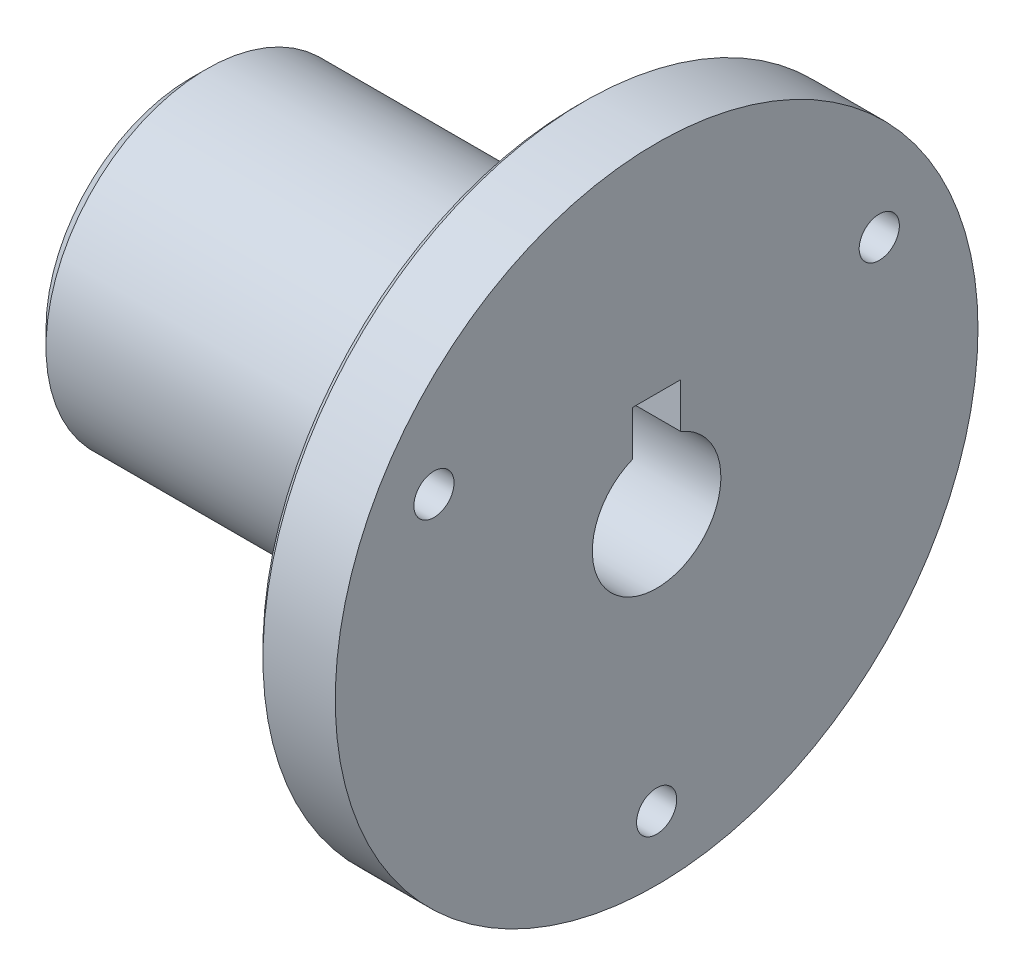
ISO-10303-21;
HEADER;
FILE_DESCRIPTION(('STEP AP214'),'2;1');
FILE_NAME('part.step','',(''),(''),'','','');
FILE_SCHEMA(('AUTOMOTIVE_DESIGN { 1 0 10303 214 1 1 1 1 }'));
ENDSEC;
DATA;
#1=APPLICATION_CONTEXT('core data for automotive mechanical design processes');
#2=APPLICATION_PROTOCOL_DEFINITION('international standard','automotive_design',2000,#1);
#3=PRODUCT_CONTEXT('',#1,'mechanical');
#4=PRODUCT('Part','Part','',(#3));
#5=PRODUCT_RELATED_PRODUCT_CATEGORY('part','',(#4));
#6=PRODUCT_DEFINITION_FORMATION('','',#4);
#7=PRODUCT_DEFINITION_CONTEXT('part definition',#1,'design');
#8=PRODUCT_DEFINITION('design','',#6,#7);
#9=PRODUCT_DEFINITION_SHAPE('','',#8);
#10=(LENGTH_UNIT() NAMED_UNIT(*) SI_UNIT(.MILLI.,.METRE.));
#11=(NAMED_UNIT(*) PLANE_ANGLE_UNIT() SI_UNIT($,.RADIAN.));
#12=(NAMED_UNIT(*) SI_UNIT($,.STERADIAN.) SOLID_ANGLE_UNIT());
#13=UNCERTAINTY_MEASURE_WITH_UNIT(LENGTH_MEASURE(1.E-05),#10,'distance_accuracy_value','');
#14=(GEOMETRIC_REPRESENTATION_CONTEXT(3) GLOBAL_UNCERTAINTY_ASSIGNED_CONTEXT((#13)) GLOBAL_UNIT_ASSIGNED_CONTEXT((#10,
#11,#12)) REPRESENTATION_CONTEXT('',''));
#15=CARTESIAN_POINT('',(0.,0.,0.));
#16=DIRECTION('',(0.,0.,1.));
#17=DIRECTION('',(1.,0.,0.));
#18=AXIS2_PLACEMENT_3D('',#15,#16,#17);
#19=CARTESIAN_POINT('',(0.,0.,0.));
#20=DIRECTION('',(1.,0.,0.));
#21=DIRECTION('',(0.,0.,-1.));
#22=AXIS2_PLACEMENT_3D('',#19,#20,#21);
#23=PLANE('',#22);
#24=CARTESIAN_POINT('',(0.,0.,0.));
#25=DIRECTION('',(1.,0.,0.));
#26=DIRECTION('',(0.,0.,-1.));
#27=AXIS2_PLACEMENT_3D('',#24,#25,#26);
#28=CIRCLE('',#27,9.);
#29=CARTESIAN_POINT('',(0.,0.,-9.));
#30=VERTEX_POINT('',#29);
#31=EDGE_CURVE('E304',#30,#30,#28,.F.);
#32=ORIENTED_EDGE('',*,*,#31,.T.);
#33=EDGE_LOOP('',(#32));
#34=FACE_BOUND('',#33,.T.);
#35=DIRECTION('',(0.,-1.,0.));
#36=VECTOR('',#35,1.);
#37=CARTESIAN_POINT('',(0.,6.,1.5));
#38=LINE('',#37,#36);
#39=CARTESIAN_POINT('',(0.,6.5,1.5));
#40=VERTEX_POINT('',#39);
#41=CARTESIAN_POINT('',(0.,4.24264068711928,1.5));
#42=VERTEX_POINT('',#41);
#43=EDGE_CURVE('E145',#40,#42,#38,.T.);
#44=ORIENTED_EDGE('',*,*,#43,.T.);
#45=CARTESIAN_POINT('',(0.,0.,0.));
#46=DIRECTION('',(1.,0.,0.));
#47=DIRECTION('',(0.,0.,-1.));
#48=AXIS2_PLACEMENT_3D('',#45,#46,#47);
#49=CIRCLE('',#48,4.5);
#50=CARTESIAN_POINT('',(0.,4.24264068711928,-1.5));
#51=VERTEX_POINT('',#50);
#52=EDGE_CURVE('E98',#42,#51,#49,.T.);
#53=ORIENTED_EDGE('',*,*,#52,.T.);
#54=DIRECTION('',(0.,1.,0.));
#55=VECTOR('',#54,1.);
#56=CARTESIAN_POINT('',(0.,6.5,-1.5));
#57=LINE('',#56,#55);
#58=CARTESIAN_POINT('',(0.,6.5,-1.5));
#59=VERTEX_POINT('',#58);
#60=EDGE_CURVE('E140',#51,#59,#57,.T.);
#61=ORIENTED_EDGE('',*,*,#60,.T.);
#62=DIRECTION('',(0.,0.,1.));
#63=VECTOR('',#62,1.);
#64=CARTESIAN_POINT('',(0.,6.5,1.5));
#65=LINE('',#64,#63);
#66=EDGE_CURVE('E142',#59,#40,#65,.T.);
#67=ORIENTED_EDGE('',*,*,#66,.T.);
#68=EDGE_LOOP('',(#44,#53,#61,#67));
#69=FACE_BOUND('',#68,.T.);
#70=ADVANCED_FACE('F44',(#34,#69),#23,.F.);
#71=CARTESIAN_POINT('',(24.,0.,0.));
#72=DIRECTION('',(-1.,0.,0.));
#73=DIRECTION('',(0.,0.,1.));
#74=AXIS2_PLACEMENT_3D('',#71,#72,#73);
#75=CYLINDRICAL_SURFACE('',#74,10.);
#76=CARTESIAN_POINT('',(22.,0.,0.));
#77=DIRECTION('',(1.,0.,0.));
#78=DIRECTION('',(0.,0.,-1.));
#79=AXIS2_PLACEMENT_3D('',#76,#77,#78);
#80=CIRCLE('',#79,10.);
#81=CARTESIAN_POINT('',(22.,0.,-10.));
#82=VERTEX_POINT('',#81);
#83=EDGE_CURVE('E11',#82,#82,#80,.F.);
#84=ORIENTED_EDGE('',*,*,#83,.T.);
#85=EDGE_LOOP('',(#84));
#86=FACE_BOUND('',#85,.T.);
#87=CARTESIAN_POINT('',(0.999999999999994,0.,0.));
#88=DIRECTION('',(1.,0.,0.));
#89=DIRECTION('',(0.,0.,-1.));
#90=AXIS2_PLACEMENT_3D('',#87,#88,#89);
#91=CIRCLE('',#90,10.);
#92=CARTESIAN_POINT('',(0.999999999999994,0.,-10.));
#93=VERTEX_POINT('',#92);
#94=EDGE_CURVE('E189',#93,#93,#91,.T.);
#95=ORIENTED_EDGE('',*,*,#94,.T.);
#96=EDGE_LOOP('',(#95));
#97=FACE_BOUND('',#96,.T.);
#98=ADVANCED_FACE('F179',(#86,#97),#75,.T.);
#99=CARTESIAN_POINT('',(24.,0.,0.));
#100=DIRECTION('',(-1.,0.,0.));
#101=DIRECTION('',(0.,0.,1.));
#102=AXIS2_PLACEMENT_3D('',#99,#100,#101);
#103=CYLINDRICAL_SURFACE('',#102,4.);
#104=DIRECTION('',(-1.,0.,0.));
#105=VECTOR('',#104,1.);
#106=CARTESIAN_POINT('',(24.,3.70809924354783,-1.5));
#107=LINE('',#106,#105);
#108=CARTESIAN_POINT('',(29.,3.70809924354783,-1.5));
#109=VERTEX_POINT('',#108);
#110=CARTESIAN_POINT('',(0.499999999999997,3.70809924354783,-1.5));
#111=VERTEX_POINT('',#110);
#112=EDGE_CURVE('E99',#109,#111,#107,.T.);
#113=ORIENTED_EDGE('',*,*,#112,.T.);
#114=CARTESIAN_POINT('',(0.499999999999997,0.,0.));
#115=DIRECTION('',(1.,0.,0.));
#116=DIRECTION('',(0.,0.,-1.));
#117=AXIS2_PLACEMENT_3D('',#114,#115,#116);
#118=CIRCLE('',#117,4.);
#119=CARTESIAN_POINT('',(0.499999999999997,3.70809924354783,1.5));
#120=VERTEX_POINT('',#119);
#121=EDGE_CURVE('E60',#111,#120,#118,.F.);
#122=ORIENTED_EDGE('',*,*,#121,.T.);
#123=DIRECTION('',(-1.,0.,0.));
#124=VECTOR('',#123,1.);
#125=CARTESIAN_POINT('',(24.,3.70809924354783,1.5));
#126=LINE('',#125,#124);
#127=CARTESIAN_POINT('',(29.,3.70809924354783,1.5));
#128=VERTEX_POINT('',#127);
#129=EDGE_CURVE('E90',#128,#120,#126,.T.);
#130=ORIENTED_EDGE('',*,*,#129,.F.);
#131=CARTESIAN_POINT('',(29.,0.,0.));
#132=DIRECTION('',(1.,0.,0.));
#133=DIRECTION('',(0.,0.,-1.));
#134=AXIS2_PLACEMENT_3D('',#131,#132,#133);
#135=CIRCLE('',#134,4.);
#136=EDGE_CURVE('E94',#128,#109,#135,.T.);
#137=ORIENTED_EDGE('',*,*,#136,.T.);
#138=EDGE_LOOP('',(#113,#122,#130,#137));
#139=FACE_BOUND('',#138,.T.);
#140=ADVANCED_FACE('F92',(#139),#103,.F.);
#141=CARTESIAN_POINT('',(24.,6.5,-1.5));
#142=DIRECTION('',(0.,0.,1.));
#143=DIRECTION('',(0.,-1.,0.));
#144=AXIS2_PLACEMENT_3D('',#141,#142,#143);
#145=PLANE('',#144);
#146=ORIENTED_EDGE('',*,*,#60,.F.);
#147=CARTESIAN_POINT('',(0.,4.24264068711928,-1.5));
#148=CARTESIAN_POINT('',(0.0837070203685099,4.15390002957356,-1.5));
#149=CARTESIAN_POINT('',(0.167227186483466,4.06498459207766,-1.5));
#150=CARTESIAN_POINT('',(0.333893853343581,3.88680411106813,-1.5));
#151=CARTESIAN_POINT('',(0.417040353895291,3.79753906737354,-1.5));
#152=CARTESIAN_POINT('',(0.499999999999997,3.70809924354783,-1.5));
#153=B_SPLINE_CURVE_WITH_KNOTS('',3,(#147,#148,#149,#150,#151,#152),.UNSPECIFIED.,.F.,.F.,(4,2,
4),(0.,0.365970160746226,0.731940510936126),.UNSPECIFIED.);
#154=EDGE_CURVE('E68',#51,#111,#153,.T.);
#155=ORIENTED_EDGE('',*,*,#154,.T.);
#156=ORIENTED_EDGE('',*,*,#112,.F.);
#157=DIRECTION('',(0.,1.,0.));
#158=VECTOR('',#157,1.);
#159=CARTESIAN_POINT('',(29.,6.5,-1.5));
#160=LINE('',#159,#158);
#161=CARTESIAN_POINT('',(29.,6.5,-1.5));
#162=VERTEX_POINT('',#161);
#163=EDGE_CURVE('E114',#109,#162,#160,.T.);
#164=ORIENTED_EDGE('',*,*,#163,.T.);
#165=DIRECTION('',(-1.,0.,0.));
#166=VECTOR('',#165,1.);
#167=CARTESIAN_POINT('',(24.,6.5,-1.5));
#168=LINE('',#167,#166);
#169=EDGE_CURVE('E149',#162,#59,#168,.T.);
#170=ORIENTED_EDGE('',*,*,#169,.T.);
#171=EDGE_LOOP('',(#146,#155,#156,#164,#170));
#172=FACE_BOUND('',#171,.T.);
#173=ADVANCED_FACE('F163',(#172),#145,.T.);
#174=CARTESIAN_POINT('',(24.,6.5,1.5));
#175=DIRECTION('',(0.,-1.,0.));
#176=DIRECTION('',(0.,0.,-1.));
#177=AXIS2_PLACEMENT_3D('',#174,#175,#176);
#178=PLANE('',#177);
#179=ORIENTED_EDGE('',*,*,#66,.F.);
#180=ORIENTED_EDGE('',*,*,#169,.F.);
#181=DIRECTION('',(0.,0.,1.));
#182=VECTOR('',#181,1.);
#183=CARTESIAN_POINT('',(29.,6.5,1.5));
#184=LINE('',#183,#182);
#185=CARTESIAN_POINT('',(29.,6.5,1.5));
#186=VERTEX_POINT('',#185);
#187=EDGE_CURVE('E109',#162,#186,#184,.T.);
#188=ORIENTED_EDGE('',*,*,#187,.T.);
#189=DIRECTION('',(-1.,0.,0.));
#190=VECTOR('',#189,1.);
#191=CARTESIAN_POINT('',(24.,6.5,1.5));
#192=LINE('',#191,#190);
#193=EDGE_CURVE('E105',#186,#40,#192,.T.);
#194=ORIENTED_EDGE('',*,*,#193,.T.);
#195=EDGE_LOOP('',(#179,#180,#188,#194));
#196=FACE_BOUND('',#195,.T.);
#197=ADVANCED_FACE('F195',(#196),#178,.T.);
#198=CARTESIAN_POINT('',(24.,6.,1.5));
#199=DIRECTION('',(0.,0.,-1.));
#200=DIRECTION('',(0.,1.,0.));
#201=AXIS2_PLACEMENT_3D('',#198,#199,#200);
#202=PLANE('',#201);
#203=ORIENTED_EDGE('',*,*,#129,.T.);
#204=CARTESIAN_POINT('',(0.499999999999997,3.70809924354783,1.5));
#205=CARTESIAN_POINT('',(0.417040353895291,3.79753906737355,1.5));
#206=CARTESIAN_POINT('',(0.333893853343581,3.88680411106813,1.5));
#207=CARTESIAN_POINT('',(0.167227186483466,4.06498459207766,1.5));
#208=CARTESIAN_POINT('',(0.0837070203685101,4.15390002957356,1.5));
#209=CARTESIAN_POINT('',(0.,4.24264068711928,1.5));
#210=B_SPLINE_CURVE_WITH_KNOTS('',3,(#204,#205,#206,#207,#208,#209),.UNSPECIFIED.,.F.,.F.,(4,2,
4),(0.,0.3659703501899,0.731940510936127),.UNSPECIFIED.);
#211=EDGE_CURVE('E182',#120,#42,#210,.T.);
#212=ORIENTED_EDGE('',*,*,#211,.T.);
#213=ORIENTED_EDGE('',*,*,#43,.F.);
#214=ORIENTED_EDGE('',*,*,#193,.F.);
#215=DIRECTION('',(0.,-1.,0.));
#216=VECTOR('',#215,1.);
#217=CARTESIAN_POINT('',(29.,6.5,1.5));
#218=LINE('',#217,#216);
#219=EDGE_CURVE('E102',#186,#128,#218,.T.);
#220=ORIENTED_EDGE('',*,*,#219,.T.);
#221=EDGE_LOOP('',(#203,#212,#213,#214,#220));
#222=FACE_BOUND('',#221,.T.);
#223=ADVANCED_FACE('F103',(#222),#202,.T.);
#224=CARTESIAN_POINT('',(24.,0.,0.));
#225=DIRECTION('',(1.,0.,0.));
#226=DIRECTION('',(0.,0.,-1.));
#227=AXIS2_PLACEMENT_3D('',#224,#225,#226);
#228=PLANE('',#227);
#229=CARTESIAN_POINT('',(24.,0.,0.));
#230=DIRECTION('',(1.,0.,0.));
#231=DIRECTION('',(0.,0.,-1.));
#232=AXIS2_PLACEMENT_3D('',#229,#230,#231);
#233=CIRCLE('',#232,12.);
#234=CARTESIAN_POINT('',(24.,0.,-12.));
#235=VERTEX_POINT('',#234);
#236=EDGE_CURVE('E53',#235,#235,#233,.T.);
#237=ORIENTED_EDGE('',*,*,#236,.T.);
#238=EDGE_LOOP('',(#237));
#239=FACE_BOUND('',#238,.T.);
#240=CARTESIAN_POINT('',(24.,0.,0.));
#241=DIRECTION('',(1.,0.,0.));
#242=DIRECTION('',(0.,0.,-1.));
#243=AXIS2_PLACEMENT_3D('',#240,#241,#242);
#244=CIRCLE('',#243,19.5);
#245=CARTESIAN_POINT('',(24.,0.,-19.5));
#246=VERTEX_POINT('',#245);
#247=EDGE_CURVE('E298',#246,#246,#244,.F.);
#248=ORIENTED_EDGE('',*,*,#247,.T.);
#249=EDGE_LOOP('',(#248));
#250=FACE_BOUND('',#249,.T.);
#251=CARTESIAN_POINT('',(24.,7.99999999999991,13.8564064605511));
#252=DIRECTION('',(1.,0.,0.));
#253=DIRECTION('',(0.,0.,-1.));
#254=AXIS2_PLACEMENT_3D('',#251,#252,#253);
#255=CIRCLE('',#254,1.25);
#256=CARTESIAN_POINT('',(24.,7.99999999999991,12.6064064605511));
#257=VERTEX_POINT('',#256);
#258=EDGE_CURVE('E122',#257,#257,#255,.T.);
#259=ORIENTED_EDGE('',*,*,#258,.T.);
#260=EDGE_LOOP('',(#259));
#261=FACE_BOUND('',#260,.T.);
#262=CARTESIAN_POINT('',(24.,8.,-13.856406460551));
#263=DIRECTION('',(1.,0.,0.));
#264=DIRECTION('',(0.,0.,-1.));
#265=AXIS2_PLACEMENT_3D('',#262,#263,#264);
#266=CIRCLE('',#265,1.25);
#267=CARTESIAN_POINT('',(24.,8.,-15.106406460551));
#268=VERTEX_POINT('',#267);
#269=EDGE_CURVE('E128',#268,#268,#266,.T.);
#270=ORIENTED_EDGE('',*,*,#269,.T.);
#271=EDGE_LOOP('',(#270));
#272=FACE_BOUND('',#271,.T.);
#273=CARTESIAN_POINT('',(24.,-16.,0.));
#274=DIRECTION('',(1.,0.,0.));
#275=DIRECTION('',(0.,0.,-1.));
#276=AXIS2_PLACEMENT_3D('',#273,#274,#275);
#277=CIRCLE('',#276,1.25);
#278=CARTESIAN_POINT('',(24.,-16.,-1.25));
#279=VERTEX_POINT('',#278);
#280=EDGE_CURVE('E134',#279,#279,#277,.T.);
#281=ORIENTED_EDGE('',*,*,#280,.T.);
#282=EDGE_LOOP('',(#281));
#283=FACE_BOUND('',#282,.T.);
#284=ADVANCED_FACE('F194',(#239,#250,#261,#272,#283),#228,.F.);
#285=CARTESIAN_POINT('',(29.,0.,0.));
#286=DIRECTION('',(-1.,0.,0.));
#287=DIRECTION('',(0.,0.,1.));
#288=AXIS2_PLACEMENT_3D('',#285,#286,#287);
#289=CYLINDRICAL_SURFACE('',#288,20.);
#290=CARTESIAN_POINT('',(24.5,0.,0.));
#291=DIRECTION('',(1.,0.,0.));
#292=DIRECTION('',(0.,0.,-1.));
#293=AXIS2_PLACEMENT_3D('',#290,#291,#292);
#294=CIRCLE('',#293,20.);
#295=CARTESIAN_POINT('',(24.5,0.,-20.));
#296=VERTEX_POINT('',#295);
#297=EDGE_CURVE('E300',#296,#296,#294,.T.);
#298=ORIENTED_EDGE('',*,*,#297,.T.);
#299=EDGE_LOOP('',(#298));
#300=FACE_BOUND('',#299,.T.);
#301=CARTESIAN_POINT('',(29.,0.,0.));
#302=DIRECTION('',(1.,0.,0.));
#303=DIRECTION('',(0.,0.,-1.));
#304=AXIS2_PLACEMENT_3D('',#301,#302,#303);
#305=CIRCLE('',#304,20.);
#306=CARTESIAN_POINT('',(29.,0.,-20.));
#307=VERTEX_POINT('',#306);
#308=EDGE_CURVE('E137',#307,#307,#305,.T.);
#309=ORIENTED_EDGE('',*,*,#308,.F.);
#310=EDGE_LOOP('',(#309));
#311=FACE_BOUND('',#310,.T.);
#312=ADVANCED_FACE('F196',(#300,#311),#289,.T.);
#313=CARTESIAN_POINT('',(29.,0.,0.));
#314=DIRECTION('',(1.,0.,0.));
#315=DIRECTION('',(0.,0.,-1.));
#316=AXIS2_PLACEMENT_3D('',#313,#314,#315);
#317=PLANE('',#316);
#318=ORIENTED_EDGE('',*,*,#187,.F.);
#319=ORIENTED_EDGE('',*,*,#163,.F.);
#320=ORIENTED_EDGE('',*,*,#136,.F.);
#321=ORIENTED_EDGE('',*,*,#219,.F.);
#322=EDGE_LOOP('',(#318,#319,#320,#321));
#323=FACE_BOUND('',#322,.T.);
#324=CARTESIAN_POINT('',(29.,7.99999999999991,13.8564064605511));
#325=DIRECTION('',(1.,0.,0.));
#326=DIRECTION('',(0.,0.,-1.));
#327=AXIS2_PLACEMENT_3D('',#324,#325,#326);
#328=CIRCLE('',#327,1.25);
#329=CARTESIAN_POINT('',(29.,7.99999999999991,12.6064064605511));
#330=VERTEX_POINT('',#329);
#331=EDGE_CURVE('E116',#330,#330,#328,.T.);
#332=ORIENTED_EDGE('',*,*,#331,.F.);
#333=EDGE_LOOP('',(#332));
#334=FACE_BOUND('',#333,.T.);
#335=CARTESIAN_POINT('',(29.,8.,-13.856406460551));
#336=DIRECTION('',(1.,0.,0.));
#337=DIRECTION('',(0.,0.,-1.));
#338=AXIS2_PLACEMENT_3D('',#335,#336,#337);
#339=CIRCLE('',#338,1.25);
#340=CARTESIAN_POINT('',(29.,8.,-15.106406460551));
#341=VERTEX_POINT('',#340);
#342=EDGE_CURVE('E125',#341,#341,#339,.T.);
#343=ORIENTED_EDGE('',*,*,#342,.F.);
#344=EDGE_LOOP('',(#343));
#345=FACE_BOUND('',#344,.T.);
#346=CARTESIAN_POINT('',(29.,-16.,0.));
#347=DIRECTION('',(1.,0.,0.));
#348=DIRECTION('',(0.,0.,-1.));
#349=AXIS2_PLACEMENT_3D('',#346,#347,#348);
#350=CIRCLE('',#349,1.25);
#351=CARTESIAN_POINT('',(29.,-16.,-1.25));
#352=VERTEX_POINT('',#351);
#353=EDGE_CURVE('E131',#352,#352,#350,.T.);
#354=ORIENTED_EDGE('',*,*,#353,.F.);
#355=EDGE_LOOP('',(#354));
#356=FACE_BOUND('',#355,.T.);
#357=ORIENTED_EDGE('',*,*,#308,.T.);
#358=EDGE_LOOP('',(#357));
#359=FACE_BOUND('',#358,.T.);
#360=ADVANCED_FACE('F111',(#323,#334,#345,#356,#359),#317,.T.);
#361=CARTESIAN_POINT('',(29.,-16.,0.));
#362=DIRECTION('',(1.,0.,0.));
#363=DIRECTION('',(0.,0.,-1.));
#364=AXIS2_PLACEMENT_3D('',#361,#362,#363);
#365=CYLINDRICAL_SURFACE('',#364,1.25);
#366=ORIENTED_EDGE('',*,*,#353,.T.);
#367=EDGE_LOOP('',(#366));
#368=FACE_BOUND('',#367,.T.);
#369=ORIENTED_EDGE('',*,*,#280,.F.);
#370=EDGE_LOOP('',(#369));
#371=FACE_BOUND('',#370,.T.);
#372=ADVANCED_FACE('F315',(#368,#371),#365,.F.);
#373=CARTESIAN_POINT('',(29.,8.,-13.856406460551));
#374=DIRECTION('',(1.,0.,0.));
#375=DIRECTION('',(0.,0.,-1.));
#376=AXIS2_PLACEMENT_3D('',#373,#374,#375);
#377=CYLINDRICAL_SURFACE('',#376,1.25);
#378=ORIENTED_EDGE('',*,*,#342,.T.);
#379=EDGE_LOOP('',(#378));
#380=FACE_BOUND('',#379,.T.);
#381=ORIENTED_EDGE('',*,*,#269,.F.);
#382=EDGE_LOOP('',(#381));
#383=FACE_BOUND('',#382,.T.);
#384=ADVANCED_FACE('F319',(#380,#383),#377,.F.);
#385=CARTESIAN_POINT('',(29.,7.99999999999991,13.8564064605511));
#386=DIRECTION('',(1.,0.,0.));
#387=DIRECTION('',(0.,0.,-1.));
#388=AXIS2_PLACEMENT_3D('',#385,#386,#387);
#389=CYLINDRICAL_SURFACE('',#388,1.25);
#390=ORIENTED_EDGE('',*,*,#331,.T.);
#391=EDGE_LOOP('',(#390));
#392=FACE_BOUND('',#391,.T.);
#393=ORIENTED_EDGE('',*,*,#258,.F.);
#394=EDGE_LOOP('',(#393));
#395=FACE_BOUND('',#394,.T.);
#396=ADVANCED_FACE('F177',(#392,#395),#389,.F.);
#397=CARTESIAN_POINT('',(0.,0.,0.));
#398=DIRECTION('',(-1.,0.,0.));
#399=DIRECTION('',(0.,0.,1.));
#400=AXIS2_PLACEMENT_3D('',#397,#398,#399);
#401=CONICAL_SURFACE('',#400,4.5,0.785398163397448);
#402=ORIENTED_EDGE('',*,*,#211,.F.);
#403=ORIENTED_EDGE('',*,*,#121,.F.);
#404=ORIENTED_EDGE('',*,*,#154,.F.);
#405=ORIENTED_EDGE('',*,*,#52,.F.);
#406=EDGE_LOOP('',(#402,#403,#404,#405));
#407=FACE_BOUND('',#406,.T.);
#408=ADVANCED_FACE('F168',(#407),#401,.F.);
#409=CARTESIAN_POINT('',(0.999999999999994,0.,0.));
#410=DIRECTION('',(1.,0.,0.));
#411=DIRECTION('',(0.,0.,-1.));
#412=AXIS2_PLACEMENT_3D('',#409,#410,#411);
#413=CONICAL_SURFACE('',#412,10.,0.785398163397451);
#414=ORIENTED_EDGE('',*,*,#31,.F.);
#415=EDGE_LOOP('',(#414));
#416=FACE_BOUND('',#415,.T.);
#417=ORIENTED_EDGE('',*,*,#94,.F.);
#418=EDGE_LOOP('',(#417));
#419=FACE_BOUND('',#418,.T.);
#420=ADVANCED_FACE('F176',(#416,#419),#413,.T.);
#421=CARTESIAN_POINT('',(24.5,0.,0.));
#422=DIRECTION('',(1.,0.,0.));
#423=DIRECTION('',(0.,0.,-1.));
#424=AXIS2_PLACEMENT_3D('',#421,#422,#423);
#425=CONICAL_SURFACE('',#424,20.,0.785398163397455);
#426=ORIENTED_EDGE('',*,*,#247,.F.);
#427=EDGE_LOOP('',(#426));
#428=FACE_BOUND('',#427,.T.);
#429=ORIENTED_EDGE('',*,*,#297,.F.);
#430=EDGE_LOOP('',(#429));
#431=FACE_BOUND('',#430,.T.);
#432=ADVANCED_FACE('F253',(#428,#431),#425,.T.);
#433=CARTESIAN_POINT('',(24.,0.,0.));
#434=DIRECTION('',(1.,0.,0.));
#435=DIRECTION('',(0.,0.,-1.));
#436=AXIS2_PLACEMENT_3D('',#433,#434,#435);
#437=CONICAL_SURFACE('',#436,12.,0.785398163397454);
#438=ORIENTED_EDGE('',*,*,#83,.F.);
#439=EDGE_LOOP('',(#438));
#440=FACE_BOUND('',#439,.T.);
#441=ORIENTED_EDGE('',*,*,#236,.F.);
#442=EDGE_LOOP('',(#441));
#443=FACE_BOUND('',#442,.T.);
#444=ADVANCED_FACE('F47',(#440,#443),#437,.T.);
#445=CLOSED_SHELL('',(#70,#98,#140,#173,#197,#223,#284,#312,#360,#372,#384,#396,#408,#420,#432,#444));
#446=MANIFOLD_SOLID_BREP('B2',#445);
#447=ADVANCED_BREP_SHAPE_REPRESENTATION('',(#18,#446),#14);
#448=SHAPE_DEFINITION_REPRESENTATION(#9,#447);
ENDSEC;
END-ISO-10303-21;
